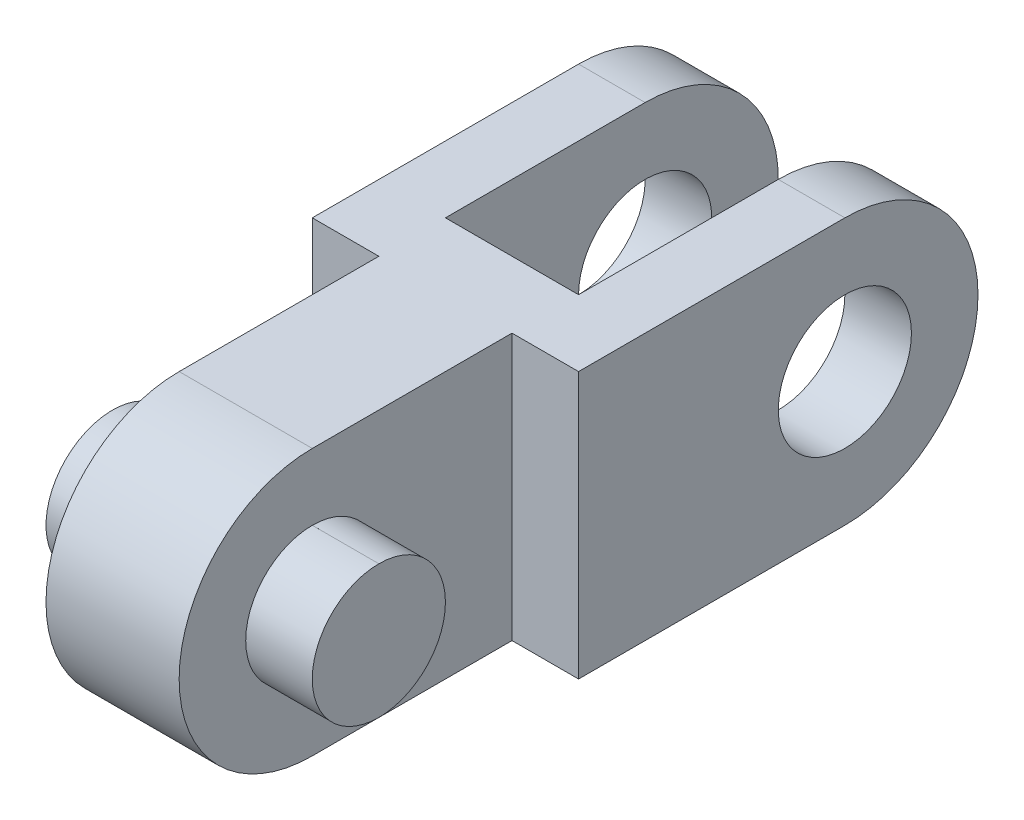
ISO-10303-21;
HEADER;
FILE_DESCRIPTION(('STEP AP214'),'2;1');
FILE_NAME('part.step','',(''),(''),'','','');
FILE_SCHEMA(('AUTOMOTIVE_DESIGN { 1 0 10303 214 1 1 1 1 }'));
ENDSEC;
DATA;
#1=APPLICATION_CONTEXT('core data for automotive mechanical design processes');
#2=APPLICATION_PROTOCOL_DEFINITION('international standard','automotive_design',2000,#1);
#3=PRODUCT_CONTEXT('',#1,'mechanical');
#4=PRODUCT('Part','Part','',(#3));
#5=PRODUCT_RELATED_PRODUCT_CATEGORY('part','',(#4));
#6=PRODUCT_DEFINITION_FORMATION('','',#4);
#7=PRODUCT_DEFINITION_CONTEXT('part definition',#1,'design');
#8=PRODUCT_DEFINITION('design','',#6,#7);
#9=PRODUCT_DEFINITION_SHAPE('','',#8);
#10=(LENGTH_UNIT() NAMED_UNIT(*) SI_UNIT(.MILLI.,.METRE.));
#11=(NAMED_UNIT(*) PLANE_ANGLE_UNIT() SI_UNIT($,.RADIAN.));
#12=(NAMED_UNIT(*) SI_UNIT($,.STERADIAN.) SOLID_ANGLE_UNIT());
#13=UNCERTAINTY_MEASURE_WITH_UNIT(LENGTH_MEASURE(1.E-05),#10,'distance_accuracy_value','');
#14=(GEOMETRIC_REPRESENTATION_CONTEXT(3) GLOBAL_UNCERTAINTY_ASSIGNED_CONTEXT((#13)) GLOBAL_UNIT_ASSIGNED_CONTEXT((#10,
#11,#12)) REPRESENTATION_CONTEXT('',''));
#15=CARTESIAN_POINT('',(0.,0.,0.));
#16=DIRECTION('',(0.,0.,1.));
#17=DIRECTION('',(1.,0.,0.));
#18=AXIS2_PLACEMENT_3D('',#15,#16,#17);
#19=CARTESIAN_POINT('',(10.,-5.,5.));
#20=DIRECTION('',(-1.,0.,0.));
#21=DIRECTION('',(0.,0.,1.));
#22=AXIS2_PLACEMENT_3D('',#19,#20,#21);
#23=CYLINDRICAL_SURFACE('',#22,5.);
#24=CARTESIAN_POINT('',(2.5,-5.,5.));
#25=DIRECTION('',(-1.,0.,0.));
#26=DIRECTION('',(0.,0.,1.));
#27=AXIS2_PLACEMENT_3D('',#24,#25,#26);
#28=CIRCLE('',#27,5.);
#29=CARTESIAN_POINT('',(2.5,-10.,5.));
#30=VERTEX_POINT('',#29);
#31=CARTESIAN_POINT('',(2.5,0.,5.));
#32=VERTEX_POINT('',#31);
#33=EDGE_CURVE('E84',#30,#32,#28,.F.);
#34=ORIENTED_EDGE('',*,*,#33,.F.);
#35=DIRECTION('',(-1.,0.,0.));
#36=VECTOR('',#35,1.);
#37=CARTESIAN_POINT('',(10.,-10.,5.));
#38=LINE('',#37,#36);
#39=CARTESIAN_POINT('',(0.,-10.,5.));
#40=VERTEX_POINT('',#39);
#41=EDGE_CURVE('E78',#30,#40,#38,.T.);
#42=ORIENTED_EDGE('',*,*,#41,.T.);
#43=CARTESIAN_POINT('',(0.,-5.,5.));
#44=DIRECTION('',(-1.,0.,0.));
#45=DIRECTION('',(0.,0.,1.));
#46=AXIS2_PLACEMENT_3D('',#43,#44,#45);
#47=CIRCLE('',#46,5.);
#48=CARTESIAN_POINT('',(0.,0.,5.));
#49=VERTEX_POINT('',#48);
#50=EDGE_CURVE('E81',#49,#40,#47,.T.);
#51=ORIENTED_EDGE('',*,*,#50,.F.);
#52=DIRECTION('',(-1.,0.,0.));
#53=VECTOR('',#52,1.);
#54=CARTESIAN_POINT('',(10.,0.,5.));
#55=LINE('',#54,#53);
#56=EDGE_CURVE('E117',#32,#49,#55,.T.);
#57=ORIENTED_EDGE('',*,*,#56,.F.);
#58=EDGE_LOOP('',(#34,#42,#51,#57));
#59=FACE_BOUND('',#58,.T.);
#60=ADVANCED_FACE('F39',(#59),#23,.T.);
#61=CARTESIAN_POINT('',(10.,-5.,22.5));
#62=DIRECTION('',(-1.,0.,0.));
#63=DIRECTION('',(0.,0.,1.));
#64=AXIS2_PLACEMENT_3D('',#61,#62,#63);
#65=PLANE('',#64);
#66=DIRECTION('',(0.,1.,0.));
#67=VECTOR('',#66,1.);
#68=CARTESIAN_POINT('',(10.,0.,22.5));
#69=LINE('',#68,#67);
#70=CARTESIAN_POINT('',(10.,-2.50008471455525,22.5));
#71=VERTEX_POINT('',#70);
#72=CARTESIAN_POINT('',(10.,-2.5,22.5));
#73=VERTEX_POINT('',#72);
#74=EDGE_CURVE('E301',#71,#73,#69,.T.);
#75=ORIENTED_EDGE('',*,*,#74,.F.);
#76=CARTESIAN_POINT('',(10.,-5.00004235727762,22.5));
#77=DIRECTION('',(-1.,0.,0.));
#78=DIRECTION('',(0.,0.,1.));
#79=AXIS2_PLACEMENT_3D('',#76,#77,#78);
#80=CIRCLE('',#79,2.49995764272238);
#81=CARTESIAN_POINT('',(10.,-7.5,22.5));
#82=VERTEX_POINT('',#81);
#83=EDGE_CURVE('E304',#82,#71,#80,.T.);
#84=ORIENTED_EDGE('',*,*,#83,.F.);
#85=CARTESIAN_POINT('',(10.,-5.,22.5));
#86=DIRECTION('',(1.,0.,0.));
#87=DIRECTION('',(0.,0.,-1.));
#88=AXIS2_PLACEMENT_3D('',#85,#86,#87);
#89=CIRCLE('',#88,2.5);
#90=EDGE_CURVE('E151',#82,#73,#89,.T.);
#91=ORIENTED_EDGE('',*,*,#90,.T.);
#92=EDGE_LOOP('',(#75,#84,#91));
#93=FACE_BOUND('',#92,.T.);
#94=ADVANCED_FACE('F326',(#93),#65,.F.);
#95=CARTESIAN_POINT('',(0.,-5.,22.5));
#96=DIRECTION('',(-1.,0.,0.));
#97=DIRECTION('',(0.,0.,1.));
#98=AXIS2_PLACEMENT_3D('',#95,#96,#97);
#99=PLANE('',#98);
#100=CARTESIAN_POINT('',(0.,-5.,5.));
#101=DIRECTION('',(-1.,0.,0.));
#102=DIRECTION('',(0.,0.,1.));
#103=AXIS2_PLACEMENT_3D('',#100,#101,#102);
#104=CIRCLE('',#103,2.49999999999999);
#105=CARTESIAN_POINT('',(0.,-5.,7.49999999999999));
#106=VERTEX_POINT('',#105);
#107=EDGE_CURVE('E137',#106,#106,#104,.T.);
#108=ORIENTED_EDGE('',*,*,#107,.F.);
#109=EDGE_LOOP('',(#108));
#110=FACE_BOUND('',#109,.T.);
#111=DIRECTION('',(0.,1.,0.));
#112=VECTOR('',#111,1.);
#113=CARTESIAN_POINT('',(0.,-10.,15.));
#114=LINE('',#113,#112);
#115=CARTESIAN_POINT('',(0.,-10.,15.));
#116=VERTEX_POINT('',#115);
#117=CARTESIAN_POINT('',(0.,0.,15.));
#118=VERTEX_POINT('',#117);
#119=EDGE_CURVE('E206',#116,#118,#114,.T.);
#120=ORIENTED_EDGE('',*,*,#119,.T.);
#121=DIRECTION('',(0.,0.,-1.));
#122=VECTOR('',#121,1.);
#123=CARTESIAN_POINT('',(0.,0.,22.5));
#124=LINE('',#123,#122);
#125=EDGE_CURVE('E97',#118,#49,#124,.T.);
#126=ORIENTED_EDGE('',*,*,#125,.T.);
#127=ORIENTED_EDGE('',*,*,#50,.T.);
#128=DIRECTION('',(0.,0.,1.));
#129=VECTOR('',#128,1.);
#130=CARTESIAN_POINT('',(0.,-10.,5.));
#131=LINE('',#130,#129);
#132=EDGE_CURVE('E95',#40,#116,#131,.T.);
#133=ORIENTED_EDGE('',*,*,#132,.T.);
#134=EDGE_LOOP('',(#120,#126,#127,#133));
#135=FACE_BOUND('',#134,.T.);
#136=ADVANCED_FACE('F94',(#110,#135),#99,.T.);
#137=CARTESIAN_POINT('',(10.,-5.,22.5));
#138=DIRECTION('',(-1.,0.,0.));
#139=DIRECTION('',(0.,0.,1.));
#140=AXIS2_PLACEMENT_3D('',#137,#138,#139);
#141=CYLINDRICAL_SURFACE('',#140,5.);
#142=CARTESIAN_POINT('',(2.5,-5.,22.5));
#143=DIRECTION('',(-1.,0.,0.));
#144=DIRECTION('',(0.,0.,-1.));
#145=AXIS2_PLACEMENT_3D('',#142,#143,#144);
#146=CIRCLE('',#145,5.);
#147=CARTESIAN_POINT('',(2.5,-10.,22.5));
#148=VERTEX_POINT('',#147);
#149=CARTESIAN_POINT('',(2.5,0.,22.5));
#150=VERTEX_POINT('',#149);
#151=EDGE_CURVE('E307',#148,#150,#146,.T.);
#152=ORIENTED_EDGE('',*,*,#151,.F.);
#153=DIRECTION('',(-1.,0.,0.));
#154=VECTOR('',#153,1.);
#155=CARTESIAN_POINT('',(10.,-10.,22.5));
#156=LINE('',#155,#154);
#157=CARTESIAN_POINT('',(7.5,-10.,22.5));
#158=VERTEX_POINT('',#157);
#159=EDGE_CURVE('E111',#158,#148,#156,.T.);
#160=ORIENTED_EDGE('',*,*,#159,.F.);
#161=CARTESIAN_POINT('',(7.5,-5.,22.5));
#162=DIRECTION('',(-1.,0.,0.));
#163=DIRECTION('',(0.,0.,1.));
#164=AXIS2_PLACEMENT_3D('',#161,#162,#163);
#165=CIRCLE('',#164,5.);
#166=CARTESIAN_POINT('',(7.5,0.,22.5));
#167=VERTEX_POINT('',#166);
#168=EDGE_CURVE('E237',#167,#158,#165,.F.);
#169=ORIENTED_EDGE('',*,*,#168,.F.);
#170=DIRECTION('',(-1.,0.,0.));
#171=VECTOR('',#170,1.);
#172=CARTESIAN_POINT('',(10.,0.,22.5));
#173=LINE('',#172,#171);
#174=EDGE_CURVE('E118',#167,#150,#173,.T.);
#175=ORIENTED_EDGE('',*,*,#174,.T.);
#176=EDGE_LOOP('',(#152,#160,#169,#175));
#177=FACE_BOUND('',#176,.T.);
#178=ADVANCED_FACE('F41',(#177),#141,.T.);
#179=CARTESIAN_POINT('',(10.,-10.,5.));
#180=DIRECTION('',(0.,-1.,0.));
#181=DIRECTION('',(0.,0.,-1.));
#182=AXIS2_PLACEMENT_3D('',#179,#180,#181);
#183=PLANE('',#182);
#184=DIRECTION('',(0.,0.,1.));
#185=VECTOR('',#184,1.);
#186=CARTESIAN_POINT('',(7.5,-10.,15.));
#187=LINE('',#186,#185);
#188=CARTESIAN_POINT('',(7.5,-10.,15.));
#189=VERTEX_POINT('',#188);
#190=EDGE_CURVE('E162',#189,#158,#187,.T.);
#191=ORIENTED_EDGE('',*,*,#190,.T.);
#192=ORIENTED_EDGE('',*,*,#159,.T.);
#193=DIRECTION('',(0.,0.,-1.));
#194=VECTOR('',#193,1.);
#195=CARTESIAN_POINT('',(2.5,-10.,22.5));
#196=LINE('',#195,#194);
#197=CARTESIAN_POINT('',(2.5,-10.,15.));
#198=VERTEX_POINT('',#197);
#199=EDGE_CURVE('E197',#148,#198,#196,.T.);
#200=ORIENTED_EDGE('',*,*,#199,.T.);
#201=DIRECTION('',(-1.,0.,0.));
#202=VECTOR('',#201,1.);
#203=CARTESIAN_POINT('',(2.5,-10.,15.));
#204=LINE('',#203,#202);
#205=EDGE_CURVE('E104',#198,#116,#204,.T.);
#206=ORIENTED_EDGE('',*,*,#205,.T.);
#207=ORIENTED_EDGE('',*,*,#132,.F.);
#208=ORIENTED_EDGE('',*,*,#41,.F.);
#209=DIRECTION('',(0.,0.,1.));
#210=VECTOR('',#209,1.);
#211=CARTESIAN_POINT('',(2.5,-10.,5.));
#212=LINE('',#211,#210);
#213=CARTESIAN_POINT('',(2.5,-10.,12.5));
#214=VERTEX_POINT('',#213);
#215=EDGE_CURVE('E177',#30,#214,#212,.T.);
#216=ORIENTED_EDGE('',*,*,#215,.T.);
#217=DIRECTION('',(1.,0.,0.));
#218=VECTOR('',#217,1.);
#219=CARTESIAN_POINT('',(2.5,-10.,12.5));
#220=LINE('',#219,#218);
#221=CARTESIAN_POINT('',(7.5,-10.,12.5));
#222=VERTEX_POINT('',#221);
#223=EDGE_CURVE('E180',#214,#222,#220,.T.);
#224=ORIENTED_EDGE('',*,*,#223,.T.);
#225=DIRECTION('',(0.,0.,-1.));
#226=VECTOR('',#225,1.);
#227=CARTESIAN_POINT('',(7.5,-10.,12.5));
#228=LINE('',#227,#226);
#229=CARTESIAN_POINT('',(7.5,-10.,5.));
#230=VERTEX_POINT('',#229);
#231=EDGE_CURVE('E175',#222,#230,#228,.T.);
#232=ORIENTED_EDGE('',*,*,#231,.T.);
#233=CARTESIAN_POINT('',(10.,-10.,5.));
#234=VERTEX_POINT('',#233);
#235=EDGE_CURVE('E63',#234,#230,#38,.T.);
#236=ORIENTED_EDGE('',*,*,#235,.F.);
#237=DIRECTION('',(0.,0.,1.));
#238=VECTOR('',#237,1.);
#239=CARTESIAN_POINT('',(10.,-10.,5.));
#240=LINE('',#239,#238);
#241=CARTESIAN_POINT('',(10.,-10.,15.));
#242=VERTEX_POINT('',#241);
#243=EDGE_CURVE('E121',#234,#242,#240,.T.);
#244=ORIENTED_EDGE('',*,*,#243,.T.);
#245=DIRECTION('',(-1.,0.,0.));
#246=VECTOR('',#245,1.);
#247=CARTESIAN_POINT('',(10.,-10.,15.));
#248=LINE('',#247,#246);
#249=EDGE_CURVE('E54',#242,#189,#248,.T.);
#250=ORIENTED_EDGE('',*,*,#249,.T.);
#251=EDGE_LOOP('',(#191,#192,#200,#206,#207,#208,#216,#224,#232,#236,#244,#250));
#252=FACE_BOUND('',#251,.T.);
#253=ADVANCED_FACE('F101',(#252),#183,.T.);
#254=CARTESIAN_POINT('',(7.5,-5.,5.));
#255=DIRECTION('',(1.,0.,0.));
#256=DIRECTION('',(0.,0.,-1.));
#257=AXIS2_PLACEMENT_3D('',#254,#255,#256);
#258=CIRCLE('',#257,5.);
#259=CARTESIAN_POINT('',(7.5,0.,5.));
#260=VERTEX_POINT('',#259);
#261=EDGE_CURVE('E294',#260,#230,#258,.F.);
#262=ORIENTED_EDGE('',*,*,#261,.F.);
#263=CARTESIAN_POINT('',(10.,0.,5.));
#264=VERTEX_POINT('',#263);
#265=EDGE_CURVE('E88',#264,#260,#55,.T.);
#266=ORIENTED_EDGE('',*,*,#265,.F.);
#267=CARTESIAN_POINT('',(10.,-5.,5.));
#268=DIRECTION('',(-1.,0.,0.));
#269=DIRECTION('',(0.,0.,1.));
#270=AXIS2_PLACEMENT_3D('',#267,#268,#269);
#271=CIRCLE('',#270,5.);
#272=EDGE_CURVE('E107',#264,#234,#271,.T.);
#273=ORIENTED_EDGE('',*,*,#272,.T.);
#274=ORIENTED_EDGE('',*,*,#235,.T.);
#275=EDGE_LOOP('',(#262,#266,#273,#274));
#276=FACE_BOUND('',#275,.T.);
#277=ADVANCED_FACE('F324',(#276),#23,.T.);
#278=CARTESIAN_POINT('',(10.,0.,22.5));
#279=DIRECTION('',(0.,1.,0.));
#280=DIRECTION('',(0.,0.,1.));
#281=AXIS2_PLACEMENT_3D('',#278,#279,#280);
#282=PLANE('',#281);
#283=DIRECTION('',(0.,0.,1.));
#284=VECTOR('',#283,1.);
#285=CARTESIAN_POINT('',(7.5,0.,15.));
#286=LINE('',#285,#284);
#287=CARTESIAN_POINT('',(7.5,0.,15.));
#288=VERTEX_POINT('',#287);
#289=EDGE_CURVE('E163',#288,#167,#286,.T.);
#290=ORIENTED_EDGE('',*,*,#289,.F.);
#291=DIRECTION('',(-1.,0.,0.));
#292=VECTOR('',#291,1.);
#293=CARTESIAN_POINT('',(10.,0.,15.));
#294=LINE('',#293,#292);
#295=CARTESIAN_POINT('',(10.,0.,15.));
#296=VERTEX_POINT('',#295);
#297=EDGE_CURVE('E160',#296,#288,#294,.T.);
#298=ORIENTED_EDGE('',*,*,#297,.F.);
#299=DIRECTION('',(0.,0.,-1.));
#300=VECTOR('',#299,1.);
#301=CARTESIAN_POINT('',(10.,0.,22.5));
#302=LINE('',#301,#300);
#303=EDGE_CURVE('E105',#296,#264,#302,.T.);
#304=ORIENTED_EDGE('',*,*,#303,.T.);
#305=ORIENTED_EDGE('',*,*,#265,.T.);
#306=DIRECTION('',(0.,0.,-1.));
#307=VECTOR('',#306,1.);
#308=CARTESIAN_POINT('',(7.5,0.,12.5));
#309=LINE('',#308,#307);
#310=CARTESIAN_POINT('',(7.5,0.,12.5));
#311=VERTEX_POINT('',#310);
#312=EDGE_CURVE('E173',#311,#260,#309,.T.);
#313=ORIENTED_EDGE('',*,*,#312,.F.);
#314=DIRECTION('',(1.,0.,0.));
#315=VECTOR('',#314,1.);
#316=CARTESIAN_POINT('',(2.5,0.,12.5));
#317=LINE('',#316,#315);
#318=CARTESIAN_POINT('',(2.5,0.,12.5));
#319=VERTEX_POINT('',#318);
#320=EDGE_CURVE('E178',#319,#311,#317,.T.);
#321=ORIENTED_EDGE('',*,*,#320,.F.);
#322=DIRECTION('',(0.,0.,1.));
#323=VECTOR('',#322,1.);
#324=CARTESIAN_POINT('',(2.5,0.,5.));
#325=LINE('',#324,#323);
#326=EDGE_CURVE('E186',#32,#319,#325,.T.);
#327=ORIENTED_EDGE('',*,*,#326,.F.);
#328=ORIENTED_EDGE('',*,*,#56,.T.);
#329=ORIENTED_EDGE('',*,*,#125,.F.);
#330=DIRECTION('',(-1.,0.,0.));
#331=VECTOR('',#330,1.);
#332=CARTESIAN_POINT('',(2.5,0.,15.));
#333=LINE('',#332,#331);
#334=CARTESIAN_POINT('',(2.5,0.,15.));
#335=VERTEX_POINT('',#334);
#336=EDGE_CURVE('E199',#335,#118,#333,.T.);
#337=ORIENTED_EDGE('',*,*,#336,.F.);
#338=DIRECTION('',(0.,0.,-1.));
#339=VECTOR('',#338,1.);
#340=CARTESIAN_POINT('',(2.5,0.,22.5));
#341=LINE('',#340,#339);
#342=EDGE_CURVE('E194',#150,#335,#341,.T.);
#343=ORIENTED_EDGE('',*,*,#342,.F.);
#344=ORIENTED_EDGE('',*,*,#174,.F.);
#345=EDGE_LOOP('',(#290,#298,#304,#305,#313,#321,#327,#328,#329,#337,#343,#344));
#346=FACE_BOUND('',#345,.T.);
#347=ADVANCED_FACE('F225',(#346),#282,.T.);
#348=CARTESIAN_POINT('',(10.,-5.,5.));
#349=DIRECTION('',(1.,0.,0.));
#350=DIRECTION('',(0.,0.,-1.));
#351=AXIS2_PLACEMENT_3D('',#348,#349,#350);
#352=CIRCLE('',#351,2.49999999999999);
#353=CARTESIAN_POINT('',(10.,-5.,2.50000000000001));
#354=VERTEX_POINT('',#353);
#355=EDGE_CURVE('E140',#354,#354,#352,.T.);
#356=ORIENTED_EDGE('',*,*,#355,.F.);
#357=EDGE_LOOP('',(#356));
#358=FACE_BOUND('',#357,.T.);
#359=ORIENTED_EDGE('',*,*,#303,.F.);
#360=DIRECTION('',(0.,1.,0.));
#361=VECTOR('',#360,1.);
#362=CARTESIAN_POINT('',(10.,-10.,15.));
#363=LINE('',#362,#361);
#364=EDGE_CURVE('E165',#242,#296,#363,.T.);
#365=ORIENTED_EDGE('',*,*,#364,.F.);
#366=ORIENTED_EDGE('',*,*,#243,.F.);
#367=ORIENTED_EDGE('',*,*,#272,.F.);
#368=EDGE_LOOP('',(#359,#365,#366,#367));
#369=FACE_BOUND('',#368,.T.);
#370=ADVANCED_FACE('F216',(#358,#369),#65,.F.);
#371=CARTESIAN_POINT('',(0.,-5.,22.5));
#372=DIRECTION('',(1.,0.,0.));
#373=DIRECTION('',(0.,0.,-1.));
#374=AXIS2_PLACEMENT_3D('',#371,#372,#373);
#375=CIRCLE('',#374,2.5);
#376=CARTESIAN_POINT('',(0.,-5.,20.));
#377=VERTEX_POINT('',#376);
#378=EDGE_CURVE('E143',#377,#377,#375,.T.);
#379=ORIENTED_EDGE('',*,*,#378,.F.);
#380=EDGE_LOOP('',(#379));
#381=FACE_BOUND('',#380,.T.);
#382=ADVANCED_FACE('F328',(#381),#99,.T.);
#383=CARTESIAN_POINT('',(2.5,-10.,15.));
#384=DIRECTION('',(0.,0.,-1.));
#385=DIRECTION('',(-1.,0.,0.));
#386=AXIS2_PLACEMENT_3D('',#383,#384,#385);
#387=PLANE('',#386);
#388=ORIENTED_EDGE('',*,*,#336,.T.);
#389=ORIENTED_EDGE('',*,*,#119,.F.);
#390=ORIENTED_EDGE('',*,*,#205,.F.);
#391=DIRECTION('',(0.,1.,0.));
#392=VECTOR('',#391,1.);
#393=CARTESIAN_POINT('',(2.5,-10.,15.));
#394=LINE('',#393,#392);
#395=EDGE_CURVE('E201',#198,#335,#394,.T.);
#396=ORIENTED_EDGE('',*,*,#395,.T.);
#397=EDGE_LOOP('',(#388,#389,#390,#396));
#398=FACE_BOUND('',#397,.T.);
#399=ADVANCED_FACE('F289',(#398),#387,.F.);
#400=CARTESIAN_POINT('',(2.5,-10.,22.5));
#401=DIRECTION('',(1.,0.,0.));
#402=DIRECTION('',(0.,0.,-1.));
#403=AXIS2_PLACEMENT_3D('',#400,#401,#402);
#404=PLANE('',#403);
#405=CARTESIAN_POINT('',(2.5,-5.,22.5));
#406=DIRECTION('',(1.,0.,0.));
#407=DIRECTION('',(0.,0.,-1.));
#408=AXIS2_PLACEMENT_3D('',#405,#406,#407);
#409=CIRCLE('',#408,2.5);
#410=CARTESIAN_POINT('',(2.5,-5.,20.));
#411=VERTEX_POINT('',#410);
#412=EDGE_CURVE('E139',#411,#411,#409,.T.);
#413=ORIENTED_EDGE('',*,*,#412,.T.);
#414=EDGE_LOOP('',(#413));
#415=FACE_BOUND('',#414,.T.);
#416=ORIENTED_EDGE('',*,*,#199,.F.);
#417=ORIENTED_EDGE('',*,*,#151,.T.);
#418=ORIENTED_EDGE('',*,*,#342,.T.);
#419=ORIENTED_EDGE('',*,*,#395,.F.);
#420=EDGE_LOOP('',(#416,#417,#418,#419));
#421=FACE_BOUND('',#420,.T.);
#422=ADVANCED_FACE('F317',(#415,#421),#404,.F.);
#423=CARTESIAN_POINT('',(7.5,-10.,12.5));
#424=DIRECTION('',(1.,0.,0.));
#425=DIRECTION('',(0.,0.,-1.));
#426=AXIS2_PLACEMENT_3D('',#423,#424,#425);
#427=PLANE('',#426);
#428=ORIENTED_EDGE('',*,*,#312,.T.);
#429=ORIENTED_EDGE('',*,*,#261,.T.);
#430=ORIENTED_EDGE('',*,*,#231,.F.);
#431=DIRECTION('',(0.,1.,0.));
#432=VECTOR('',#431,1.);
#433=CARTESIAN_POINT('',(7.5,-10.,12.5));
#434=LINE('',#433,#432);
#435=EDGE_CURVE('E191',#222,#311,#434,.T.);
#436=ORIENTED_EDGE('',*,*,#435,.T.);
#437=EDGE_LOOP('',(#428,#429,#430,#436));
#438=FACE_BOUND('',#437,.T.);
#439=CARTESIAN_POINT('',(7.5,-5.,5.));
#440=DIRECTION('',(1.,0.,0.));
#441=DIRECTION('',(0.,0.,-1.));
#442=AXIS2_PLACEMENT_3D('',#439,#440,#441);
#443=CIRCLE('',#442,2.49999999999999);
#444=CARTESIAN_POINT('',(7.5,-5.,2.50000000000001));
#445=VERTEX_POINT('',#444);
#446=EDGE_CURVE('E11',#445,#445,#443,.T.);
#447=ORIENTED_EDGE('',*,*,#446,.T.);
#448=EDGE_LOOP('',(#447));
#449=FACE_BOUND('',#448,.T.);
#450=ADVANCED_FACE('F343',(#438,#449),#427,.F.);
#451=CARTESIAN_POINT('',(2.5,-10.,12.5));
#452=DIRECTION('',(0.,0.,1.));
#453=DIRECTION('',(1.,0.,0.));
#454=AXIS2_PLACEMENT_3D('',#451,#452,#453);
#455=PLANE('',#454);
#456=ORIENTED_EDGE('',*,*,#320,.T.);
#457=ORIENTED_EDGE('',*,*,#435,.F.);
#458=ORIENTED_EDGE('',*,*,#223,.F.);
#459=DIRECTION('',(0.,1.,0.));
#460=VECTOR('',#459,1.);
#461=CARTESIAN_POINT('',(2.5,-10.,12.5));
#462=LINE('',#461,#460);
#463=EDGE_CURVE('E183',#214,#319,#462,.T.);
#464=ORIENTED_EDGE('',*,*,#463,.T.);
#465=EDGE_LOOP('',(#456,#457,#458,#464));
#466=FACE_BOUND('',#465,.T.);
#467=ADVANCED_FACE('F346',(#466),#455,.F.);
#468=CARTESIAN_POINT('',(2.5,-10.,5.));
#469=DIRECTION('',(-1.,0.,0.));
#470=DIRECTION('',(0.,0.,1.));
#471=AXIS2_PLACEMENT_3D('',#468,#469,#470);
#472=PLANE('',#471);
#473=CARTESIAN_POINT('',(2.5,-5.,5.));
#474=DIRECTION('',(-1.,0.,0.));
#475=DIRECTION('',(0.,0.,1.));
#476=AXIS2_PLACEMENT_3D('',#473,#474,#475);
#477=CIRCLE('',#476,2.49999999999999);
#478=CARTESIAN_POINT('',(2.5,-5.,7.49999999999999));
#479=VERTEX_POINT('',#478);
#480=EDGE_CURVE('E47',#479,#479,#477,.T.);
#481=ORIENTED_EDGE('',*,*,#480,.T.);
#482=EDGE_LOOP('',(#481));
#483=FACE_BOUND('',#482,.T.);
#484=ORIENTED_EDGE('',*,*,#215,.F.);
#485=ORIENTED_EDGE('',*,*,#33,.T.);
#486=ORIENTED_EDGE('',*,*,#326,.T.);
#487=ORIENTED_EDGE('',*,*,#463,.F.);
#488=EDGE_LOOP('',(#484,#485,#486,#487));
#489=FACE_BOUND('',#488,.T.);
#490=ADVANCED_FACE('F126',(#483,#489),#472,.F.);
#491=CARTESIAN_POINT('',(7.5,-10.,15.));
#492=DIRECTION('',(-1.,0.,0.));
#493=DIRECTION('',(0.,0.,1.));
#494=AXIS2_PLACEMENT_3D('',#491,#492,#493);
#495=PLANE('',#494);
#496=CARTESIAN_POINT('',(7.5,-5.,22.5));
#497=DIRECTION('',(-1.,0.,0.));
#498=DIRECTION('',(0.,0.,1.));
#499=AXIS2_PLACEMENT_3D('',#496,#497,#498);
#500=CIRCLE('',#499,2.5);
#501=CARTESIAN_POINT('',(7.5,-2.5,22.5));
#502=VERTEX_POINT('',#501);
#503=CARTESIAN_POINT('',(7.5,-7.5,22.5));
#504=VERTEX_POINT('',#503);
#505=EDGE_CURVE('E113',#502,#504,#500,.T.);
#506=ORIENTED_EDGE('',*,*,#505,.T.);
#507=CARTESIAN_POINT('',(7.5,-5.00004235727762,22.5));
#508=DIRECTION('',(-1.,0.,0.));
#509=DIRECTION('',(0.,0.,1.));
#510=AXIS2_PLACEMENT_3D('',#507,#508,#509);
#511=CIRCLE('',#510,2.49995764272238);
#512=CARTESIAN_POINT('',(7.5,-2.50008471455525,22.5));
#513=VERTEX_POINT('',#512);
#514=EDGE_CURVE('E303',#504,#513,#511,.T.);
#515=ORIENTED_EDGE('',*,*,#514,.T.);
#516=DIRECTION('',(0.,1.,0.));
#517=VECTOR('',#516,1.);
#518=CARTESIAN_POINT('',(7.5,0.,22.5));
#519=LINE('',#518,#517);
#520=EDGE_CURVE('E300',#513,#502,#519,.T.);
#521=ORIENTED_EDGE('',*,*,#520,.T.);
#522=EDGE_LOOP('',(#506,#515,#521));
#523=FACE_BOUND('',#522,.T.);
#524=ORIENTED_EDGE('',*,*,#289,.T.);
#525=ORIENTED_EDGE('',*,*,#168,.T.);
#526=ORIENTED_EDGE('',*,*,#190,.F.);
#527=DIRECTION('',(0.,1.,0.));
#528=VECTOR('',#527,1.);
#529=CARTESIAN_POINT('',(7.5,-10.,15.));
#530=LINE('',#529,#528);
#531=EDGE_CURVE('E170',#189,#288,#530,.T.);
#532=ORIENTED_EDGE('',*,*,#531,.T.);
#533=EDGE_LOOP('',(#524,#525,#526,#532));
#534=FACE_BOUND('',#533,.T.);
#535=ADVANCED_FACE('F233',(#523,#534),#495,.F.);
#536=CARTESIAN_POINT('',(10.,-10.,15.));
#537=DIRECTION('',(0.,0.,-1.));
#538=DIRECTION('',(-1.,0.,0.));
#539=AXIS2_PLACEMENT_3D('',#536,#537,#538);
#540=PLANE('',#539);
#541=ORIENTED_EDGE('',*,*,#297,.T.);
#542=ORIENTED_EDGE('',*,*,#531,.F.);
#543=ORIENTED_EDGE('',*,*,#249,.F.);
#544=ORIENTED_EDGE('',*,*,#364,.T.);
#545=EDGE_LOOP('',(#541,#542,#543,#544));
#546=FACE_BOUND('',#545,.T.);
#547=ADVANCED_FACE('F219',(#546),#540,.F.);
#548=CARTESIAN_POINT('',(7.5,-5.,22.5));
#549=DIRECTION('',(1.,0.,0.));
#550=DIRECTION('',(0.,0.,-1.));
#551=AXIS2_PLACEMENT_3D('',#548,#549,#550);
#552=CYLINDRICAL_SURFACE('',#551,2.5);
#553=DIRECTION('',(1.,0.,0.));
#554=VECTOR('',#553,1.);
#555=CARTESIAN_POINT('',(7.5,-7.5,22.5));
#556=LINE('',#555,#554);
#557=EDGE_CURVE('E157',#504,#82,#556,.T.);
#558=ORIENTED_EDGE('',*,*,#557,.F.);
#559=ORIENTED_EDGE('',*,*,#505,.F.);
#560=DIRECTION('',(1.,0.,0.));
#561=VECTOR('',#560,1.);
#562=CARTESIAN_POINT('',(7.5,-2.5,22.5));
#563=LINE('',#562,#561);
#564=EDGE_CURVE('E154',#73,#502,#563,.F.);
#565=ORIENTED_EDGE('',*,*,#564,.F.);
#566=ORIENTED_EDGE('',*,*,#90,.F.);
#567=EDGE_LOOP('',(#558,#559,#565,#566));
#568=FACE_BOUND('',#567,.T.);
#569=ADVANCED_FACE('F371',(#568),#552,.T.);
#570=CARTESIAN_POINT('',(0.,-5.,22.5));
#571=DIRECTION('',(1.,0.,0.));
#572=DIRECTION('',(0.,0.,-1.));
#573=AXIS2_PLACEMENT_3D('',#570,#571,#572);
#574=CYLINDRICAL_SURFACE('',#573,2.5);
#575=ORIENTED_EDGE('',*,*,#412,.F.);
#576=EDGE_LOOP('',(#575));
#577=FACE_BOUND('',#576,.T.);
#578=ORIENTED_EDGE('',*,*,#378,.T.);
#579=EDGE_LOOP('',(#578));
#580=FACE_BOUND('',#579,.T.);
#581=ADVANCED_FACE('F133',(#577,#580),#574,.T.);
#582=CARTESIAN_POINT('',(0.,-5.,5.));
#583=DIRECTION('',(-1.,0.,0.));
#584=DIRECTION('',(0.,0.,1.));
#585=AXIS2_PLACEMENT_3D('',#582,#583,#584);
#586=CYLINDRICAL_SURFACE('',#585,2.49999999999999);
#587=ORIENTED_EDGE('',*,*,#480,.F.);
#588=EDGE_LOOP('',(#587));
#589=FACE_BOUND('',#588,.T.);
#590=ORIENTED_EDGE('',*,*,#107,.T.);
#591=EDGE_LOOP('',(#590));
#592=FACE_BOUND('',#591,.T.);
#593=ADVANCED_FACE('F129',(#589,#592),#586,.F.);
#594=CARTESIAN_POINT('',(10.,-5.,5.));
#595=DIRECTION('',(1.,0.,0.));
#596=DIRECTION('',(0.,0.,-1.));
#597=AXIS2_PLACEMENT_3D('',#594,#595,#596);
#598=CYLINDRICAL_SURFACE('',#597,2.49999999999999);
#599=ORIENTED_EDGE('',*,*,#446,.F.);
#600=EDGE_LOOP('',(#599));
#601=FACE_BOUND('',#600,.T.);
#602=ORIENTED_EDGE('',*,*,#355,.T.);
#603=EDGE_LOOP('',(#602));
#604=FACE_BOUND('',#603,.T.);
#605=ADVANCED_FACE('F132',(#601,#604),#598,.F.);
#606=CARTESIAN_POINT('',(7.5,-5.00004235727762,22.5));
#607=DIRECTION('',(1.,0.,0.));
#608=DIRECTION('',(0.,0.,-1.));
#609=AXIS2_PLACEMENT_3D('',#606,#607,#608);
#610=CYLINDRICAL_SURFACE('',#609,2.49995764272238);
#611=ORIENTED_EDGE('',*,*,#83,.T.);
#612=DIRECTION('',(1.,0.,0.));
#613=VECTOR('',#612,1.);
#614=CARTESIAN_POINT('',(7.5,-2.50008471455525,22.5));
#615=LINE('',#614,#613);
#616=EDGE_CURVE('E298',#513,#71,#615,.T.);
#617=ORIENTED_EDGE('',*,*,#616,.F.);
#618=ORIENTED_EDGE('',*,*,#514,.F.);
#619=ORIENTED_EDGE('',*,*,#557,.T.);
#620=EDGE_LOOP('',(#611,#617,#618,#619));
#621=FACE_BOUND('',#620,.T.);
#622=ADVANCED_FACE('F393',(#621),#610,.T.);
#623=CARTESIAN_POINT('',(7.5,0.,22.5));
#624=DIRECTION('',(0.,0.,-1.));
#625=DIRECTION('',(-1.,0.,0.));
#626=AXIS2_PLACEMENT_3D('',#623,#624,#625);
#627=PLANE('',#626);
#628=ORIENTED_EDGE('',*,*,#564,.T.);
#629=ORIENTED_EDGE('',*,*,#520,.F.);
#630=ORIENTED_EDGE('',*,*,#616,.T.);
#631=ORIENTED_EDGE('',*,*,#74,.T.);
#632=EDGE_LOOP('',(#628,#629,#630,#631));
#633=FACE_BOUND('',#632,.T.);
#634=ADVANCED_FACE('F396',(#633),#627,.F.);
#635=CLOSED_SHELL('',(#60,#94,#136,#178,#253,#277,#347,#370,#382,#399,#422,#450,#467,#490,#535,
#547,#569,#581,#593,#605,#622,#634));
#636=MANIFOLD_SOLID_BREP('B2',#635);
#637=ADVANCED_BREP_SHAPE_REPRESENTATION('',(#18,#636),#14);
#638=SHAPE_DEFINITION_REPRESENTATION(#9,#637);
ENDSEC;
END-ISO-10303-21;
